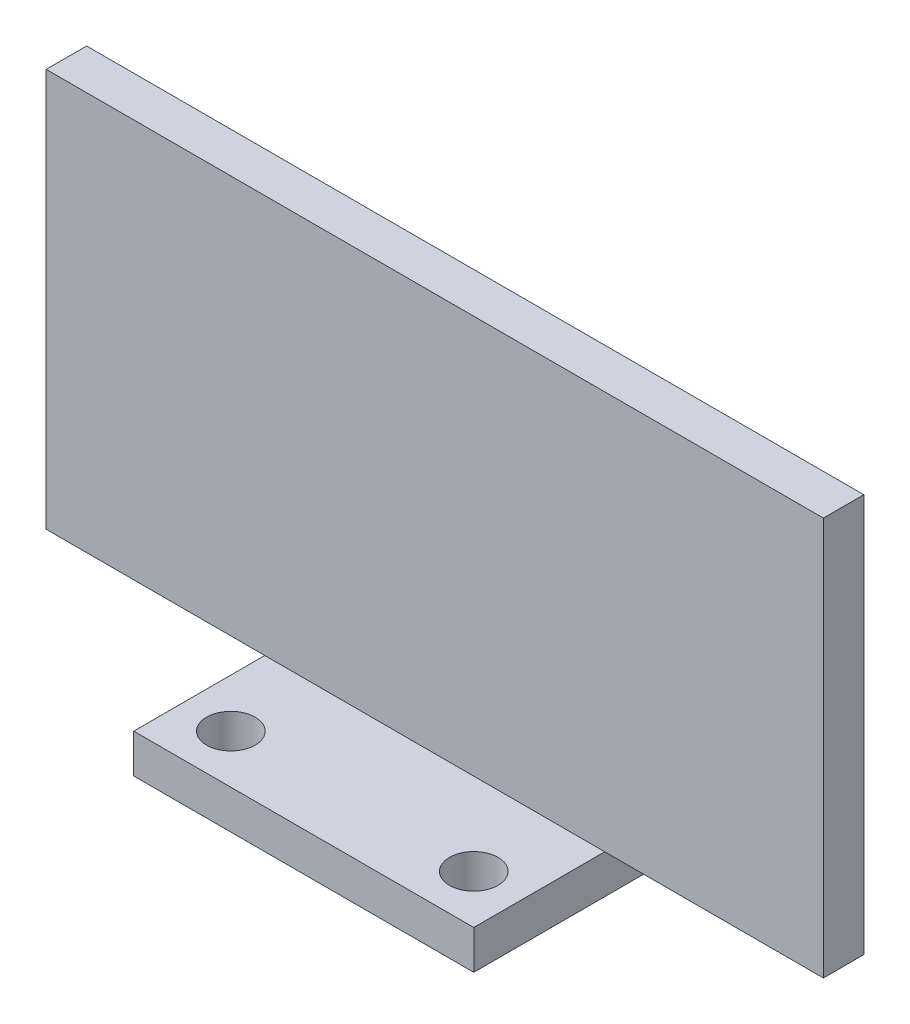
ISO-10303-21;
HEADER;
FILE_DESCRIPTION(('STEP AP214'),'2;1');
FILE_NAME('part.step','',(''),(''),'','','');
FILE_SCHEMA(('AUTOMOTIVE_DESIGN { 1 0 10303 214 1 1 1 1 }'));
ENDSEC;
DATA;
#1=APPLICATION_CONTEXT('core data for automotive mechanical design processes');
#2=APPLICATION_PROTOCOL_DEFINITION('international standard','automotive_design',2000,#1);
#3=PRODUCT_CONTEXT('',#1,'mechanical');
#4=PRODUCT('Part','Part','',(#3));
#5=PRODUCT_RELATED_PRODUCT_CATEGORY('part','',(#4));
#6=PRODUCT_DEFINITION_FORMATION('','',#4);
#7=PRODUCT_DEFINITION_CONTEXT('part definition',#1,'design');
#8=PRODUCT_DEFINITION('design','',#6,#7);
#9=PRODUCT_DEFINITION_SHAPE('','',#8);
#10=(LENGTH_UNIT() NAMED_UNIT(*) SI_UNIT(.MILLI.,.METRE.));
#11=(NAMED_UNIT(*) PLANE_ANGLE_UNIT() SI_UNIT($,.RADIAN.));
#12=(NAMED_UNIT(*) SI_UNIT($,.STERADIAN.) SOLID_ANGLE_UNIT());
#13=UNCERTAINTY_MEASURE_WITH_UNIT(LENGTH_MEASURE(1.E-05),#10,'distance_accuracy_value','');
#14=(GEOMETRIC_REPRESENTATION_CONTEXT(3) GLOBAL_UNCERTAINTY_ASSIGNED_CONTEXT((#13)) GLOBAL_UNIT_ASSIGNED_CONTEXT((#10,
#11,#12)) REPRESENTATION_CONTEXT('',''));
#15=CARTESIAN_POINT('',(0.,0.,0.));
#16=DIRECTION('',(0.,0.,1.));
#17=DIRECTION('',(1.,0.,0.));
#18=AXIS2_PLACEMENT_3D('',#15,#16,#17);
#19=CARTESIAN_POINT('',(0.,4.,0.));
#20=DIRECTION('',(0.,-1.,0.));
#21=DIRECTION('',(0.,0.,-1.));
#22=AXIS2_PLACEMENT_3D('',#19,#20,#21);
#23=PLANE('',#22);
#24=CARTESIAN_POINT('',(30.,4.,-25.));
#25=DIRECTION('',(0.,1.,0.));
#26=DIRECTION('',(0.,0.,1.));
#27=AXIS2_PLACEMENT_3D('',#24,#25,#26);
#28=CIRCLE('',#27,2.5);
#29=CARTESIAN_POINT('',(30.,4.,-22.5));
#30=VERTEX_POINT('',#29);
#31=EDGE_CURVE('E160',#30,#30,#28,.T.);
#32=ORIENTED_EDGE('',*,*,#31,.F.);
#33=EDGE_LOOP('',(#32));
#34=FACE_BOUND('',#33,.T.);
#35=CARTESIAN_POINT('',(5.,4.,-25.));
#36=DIRECTION('',(0.,1.,0.));
#37=DIRECTION('',(0.,0.,1.));
#38=AXIS2_PLACEMENT_3D('',#35,#36,#37);
#39=CIRCLE('',#38,2.5);
#40=CARTESIAN_POINT('',(5.,4.,-22.5));
#41=VERTEX_POINT('',#40);
#42=EDGE_CURVE('E166',#41,#41,#39,.T.);
#43=ORIENTED_EDGE('',*,*,#42,.F.);
#44=EDGE_LOOP('',(#43));
#45=FACE_BOUND('',#44,.T.);
#46=DIRECTION('',(-1.,0.,0.));
#47=VECTOR('',#46,1.);
#48=CARTESIAN_POINT('',(-22.5,4.,-17.6513564609073));
#49=LINE('',#48,#47);
#50=CARTESIAN_POINT('',(35.,4.,-17.6513564609073));
#51=VERTEX_POINT('',#50);
#52=CARTESIAN_POINT('',(0.,4.,-17.6513564609073));
#53=VERTEX_POINT('',#52);
#54=EDGE_CURVE('E11',#51,#53,#49,.T.);
#55=ORIENTED_EDGE('',*,*,#54,.F.);
#56=DIRECTION('',(0.,0.,-1.));
#57=VECTOR('',#56,1.);
#58=CARTESIAN_POINT('',(35.,4.,0.));
#59=LINE('',#58,#57);
#60=CARTESIAN_POINT('',(35.,4.,-30.));
#61=VERTEX_POINT('',#60);
#62=EDGE_CURVE('E178',#51,#61,#59,.T.);
#63=ORIENTED_EDGE('',*,*,#62,.T.);
#64=DIRECTION('',(-1.,0.,0.));
#65=VECTOR('',#64,1.);
#66=CARTESIAN_POINT('',(0.,4.,-30.));
#67=LINE('',#66,#65);
#68=CARTESIAN_POINT('',(0.,4.,-30.));
#69=VERTEX_POINT('',#68);
#70=EDGE_CURVE('E181',#61,#69,#67,.T.);
#71=ORIENTED_EDGE('',*,*,#70,.T.);
#72=DIRECTION('',(0.,0.,1.));
#73=VECTOR('',#72,1.);
#74=CARTESIAN_POINT('',(0.,4.,0.));
#75=LINE('',#74,#73);
#76=EDGE_CURVE('E172',#69,#53,#75,.T.);
#77=ORIENTED_EDGE('',*,*,#76,.T.);
#78=EDGE_LOOP('',(#55,#63,#71,#77));
#79=FACE_BOUND('',#78,.T.);
#80=ADVANCED_FACE('F38',(#34,#45,#79),#23,.F.);
#81=CARTESIAN_POINT('',(30.,4.,-5.));
#82=DIRECTION('',(0.,1.,0.));
#83=DIRECTION('',(0.,0.,1.));
#84=AXIS2_PLACEMENT_3D('',#81,#82,#83);
#85=CIRCLE('',#84,2.50000000000001);
#86=CARTESIAN_POINT('',(30.,4.,-2.49999999999999));
#87=VERTEX_POINT('',#86);
#88=EDGE_CURVE('E145',#87,#87,#85,.T.);
#89=ORIENTED_EDGE('',*,*,#88,.F.);
#90=EDGE_LOOP('',(#89));
#91=FACE_BOUND('',#90,.T.);
#92=CARTESIAN_POINT('',(5.,4.,-5.));
#93=DIRECTION('',(0.,1.,0.));
#94=DIRECTION('',(0.,0.,1.));
#95=AXIS2_PLACEMENT_3D('',#92,#93,#94);
#96=CIRCLE('',#95,2.5);
#97=CARTESIAN_POINT('',(5.,4.,-2.5));
#98=VERTEX_POINT('',#97);
#99=EDGE_CURVE('E154',#98,#98,#96,.T.);
#100=ORIENTED_EDGE('',*,*,#99,.F.);
#101=EDGE_LOOP('',(#100));
#102=FACE_BOUND('',#101,.T.);
#103=DIRECTION('',(1.,0.,0.));
#104=VECTOR('',#103,1.);
#105=CARTESIAN_POINT('',(-22.5,4.,-13.4880694561769));
#106=LINE('',#105,#104);
#107=CARTESIAN_POINT('',(0.,4.,-13.4880694561769));
#108=VERTEX_POINT('',#107);
#109=CARTESIAN_POINT('',(35.,4.,-13.4880694561769));
#110=VERTEX_POINT('',#109);
#111=EDGE_CURVE('E47',#108,#110,#106,.T.);
#112=ORIENTED_EDGE('',*,*,#111,.F.);
#113=CARTESIAN_POINT('',(0.,4.,0.));
#114=VERTEX_POINT('',#113);
#115=EDGE_CURVE('E176',#108,#114,#75,.T.);
#116=ORIENTED_EDGE('',*,*,#115,.T.);
#117=DIRECTION('',(1.,0.,0.));
#118=VECTOR('',#117,1.);
#119=CARTESIAN_POINT('',(0.,4.,0.));
#120=LINE('',#119,#118);
#121=CARTESIAN_POINT('',(35.,4.,0.));
#122=VERTEX_POINT('',#121);
#123=EDGE_CURVE('E174',#114,#122,#120,.T.);
#124=ORIENTED_EDGE('',*,*,#123,.T.);
#125=EDGE_CURVE('E179',#122,#110,#59,.T.);
#126=ORIENTED_EDGE('',*,*,#125,.T.);
#127=EDGE_LOOP('',(#112,#116,#124,#126));
#128=FACE_BOUND('',#127,.T.);
#129=ADVANCED_FACE('F245',(#91,#102,#128),#23,.F.);
#130=CARTESIAN_POINT('',(0.,0.,0.));
#131=DIRECTION('',(0.,-1.,0.));
#132=DIRECTION('',(0.,0.,-1.));
#133=AXIS2_PLACEMENT_3D('',#130,#131,#132);
#134=PLANE('',#133);
#135=CARTESIAN_POINT('',(5.,0.,-5.));
#136=DIRECTION('',(0.,1.,0.));
#137=DIRECTION('',(0.,0.,1.));
#138=AXIS2_PLACEMENT_3D('',#135,#136,#137);
#139=CIRCLE('',#138,2.5);
#140=CARTESIAN_POINT('',(5.,0.,-2.5));
#141=VERTEX_POINT('',#140);
#142=EDGE_CURVE('E152',#141,#141,#139,.T.);
#143=ORIENTED_EDGE('',*,*,#142,.T.);
#144=EDGE_LOOP('',(#143));
#145=FACE_BOUND('',#144,.T.);
#146=CARTESIAN_POINT('',(5.,0.,-25.));
#147=DIRECTION('',(0.,1.,0.));
#148=DIRECTION('',(0.,0.,1.));
#149=AXIS2_PLACEMENT_3D('',#146,#147,#148);
#150=CIRCLE('',#149,2.5);
#151=CARTESIAN_POINT('',(5.,0.,-22.5));
#152=VERTEX_POINT('',#151);
#153=EDGE_CURVE('E163',#152,#152,#150,.T.);
#154=ORIENTED_EDGE('',*,*,#153,.T.);
#155=EDGE_LOOP('',(#154));
#156=FACE_BOUND('',#155,.T.);
#157=DIRECTION('',(0.,0.,1.));
#158=VECTOR('',#157,1.);
#159=CARTESIAN_POINT('',(0.,0.,0.));
#160=LINE('',#159,#158);
#161=CARTESIAN_POINT('',(0.,0.,-30.));
#162=VERTEX_POINT('',#161);
#163=CARTESIAN_POINT('',(0.,0.,0.));
#164=VERTEX_POINT('',#163);
#165=EDGE_CURVE('E169',#162,#164,#160,.T.);
#166=ORIENTED_EDGE('',*,*,#165,.F.);
#167=DIRECTION('',(-1.,0.,0.));
#168=VECTOR('',#167,1.);
#169=CARTESIAN_POINT('',(0.,0.,-30.));
#170=LINE('',#169,#168);
#171=CARTESIAN_POINT('',(35.,0.,-30.));
#172=VERTEX_POINT('',#171);
#173=EDGE_CURVE('E191',#172,#162,#170,.T.);
#174=ORIENTED_EDGE('',*,*,#173,.F.);
#175=DIRECTION('',(0.,0.,-1.));
#176=VECTOR('',#175,1.);
#177=CARTESIAN_POINT('',(35.,0.,0.));
#178=LINE('',#177,#176);
#179=CARTESIAN_POINT('',(35.,0.,0.));
#180=VERTEX_POINT('',#179);
#181=EDGE_CURVE('E189',#180,#172,#178,.T.);
#182=ORIENTED_EDGE('',*,*,#181,.F.);
#183=DIRECTION('',(1.,0.,0.));
#184=VECTOR('',#183,1.);
#185=CARTESIAN_POINT('',(0.,0.,0.));
#186=LINE('',#185,#184);
#187=EDGE_CURVE('E187',#164,#180,#186,.T.);
#188=ORIENTED_EDGE('',*,*,#187,.F.);
#189=EDGE_LOOP('',(#166,#174,#182,#188));
#190=FACE_BOUND('',#189,.T.);
#191=CARTESIAN_POINT('',(30.,0.,-25.));
#192=DIRECTION('',(0.,1.,0.));
#193=DIRECTION('',(0.,0.,1.));
#194=AXIS2_PLACEMENT_3D('',#191,#192,#193);
#195=CIRCLE('',#194,2.5);
#196=CARTESIAN_POINT('',(30.,0.,-22.5));
#197=VERTEX_POINT('',#196);
#198=EDGE_CURVE('E157',#197,#197,#195,.T.);
#199=ORIENTED_EDGE('',*,*,#198,.T.);
#200=EDGE_LOOP('',(#199));
#201=FACE_BOUND('',#200,.T.);
#202=CARTESIAN_POINT('',(30.,0.,-5.));
#203=DIRECTION('',(0.,1.,0.));
#204=DIRECTION('',(0.,0.,1.));
#205=AXIS2_PLACEMENT_3D('',#202,#203,#204);
#206=CIRCLE('',#205,2.50000000000001);
#207=CARTESIAN_POINT('',(30.,0.,-2.49999999999999));
#208=VERTEX_POINT('',#207);
#209=EDGE_CURVE('E142',#208,#208,#206,.T.);
#210=ORIENTED_EDGE('',*,*,#209,.T.);
#211=EDGE_LOOP('',(#210));
#212=FACE_BOUND('',#211,.T.);
#213=ADVANCED_FACE('F248',(#145,#156,#190,#201,#212),#134,.T.);
#214=CARTESIAN_POINT('',(0.,4.,0.));
#215=DIRECTION('',(1.,0.,0.));
#216=DIRECTION('',(0.,0.,-1.));
#217=AXIS2_PLACEMENT_3D('',#214,#215,#216);
#218=PLANE('',#217);
#219=ORIENTED_EDGE('',*,*,#165,.T.);
#220=DIRECTION('',(0.,-1.,0.));
#221=VECTOR('',#220,1.);
#222=CARTESIAN_POINT('',(0.,4.,0.));
#223=LINE('',#222,#221);
#224=EDGE_CURVE('E42',#114,#164,#223,.T.);
#225=ORIENTED_EDGE('',*,*,#224,.F.);
#226=ORIENTED_EDGE('',*,*,#115,.F.);
#227=EDGE_CURVE('E175',#53,#108,#75,.T.);
#228=ORIENTED_EDGE('',*,*,#227,.F.);
#229=ORIENTED_EDGE('',*,*,#76,.F.);
#230=DIRECTION('',(0.,-1.,0.));
#231=VECTOR('',#230,1.);
#232=CARTESIAN_POINT('',(0.,4.,-30.));
#233=LINE('',#232,#231);
#234=EDGE_CURVE('E184',#69,#162,#233,.T.);
#235=ORIENTED_EDGE('',*,*,#234,.T.);
#236=EDGE_LOOP('',(#219,#225,#226,#228,#229,#235));
#237=FACE_BOUND('',#236,.T.);
#238=ADVANCED_FACE('F40',(#237),#218,.F.);
#239=CARTESIAN_POINT('',(0.,4.,0.));
#240=DIRECTION('',(0.,0.,-1.));
#241=DIRECTION('',(-1.,0.,0.));
#242=AXIS2_PLACEMENT_3D('',#239,#240,#241);
#243=PLANE('',#242);
#244=ORIENTED_EDGE('',*,*,#187,.T.);
#245=DIRECTION('',(0.,-1.,0.));
#246=VECTOR('',#245,1.);
#247=CARTESIAN_POINT('',(35.,4.,0.));
#248=LINE('',#247,#246);
#249=EDGE_CURVE('E197',#122,#180,#248,.T.);
#250=ORIENTED_EDGE('',*,*,#249,.F.);
#251=ORIENTED_EDGE('',*,*,#123,.F.);
#252=ORIENTED_EDGE('',*,*,#224,.T.);
#253=EDGE_LOOP('',(#244,#250,#251,#252));
#254=FACE_BOUND('',#253,.T.);
#255=ADVANCED_FACE('F246',(#254),#243,.F.);
#256=CARTESIAN_POINT('',(35.,4.,0.));
#257=DIRECTION('',(-1.,0.,0.));
#258=DIRECTION('',(0.,0.,1.));
#259=AXIS2_PLACEMENT_3D('',#256,#257,#258);
#260=PLANE('',#259);
#261=ORIENTED_EDGE('',*,*,#181,.T.);
#262=DIRECTION('',(0.,-1.,0.));
#263=VECTOR('',#262,1.);
#264=CARTESIAN_POINT('',(35.,4.,-30.));
#265=LINE('',#264,#263);
#266=EDGE_CURVE('E195',#61,#172,#265,.T.);
#267=ORIENTED_EDGE('',*,*,#266,.F.);
#268=ORIENTED_EDGE('',*,*,#62,.F.);
#269=EDGE_CURVE('E182',#110,#51,#59,.T.);
#270=ORIENTED_EDGE('',*,*,#269,.F.);
#271=ORIENTED_EDGE('',*,*,#125,.F.);
#272=ORIENTED_EDGE('',*,*,#249,.T.);
#273=EDGE_LOOP('',(#261,#267,#268,#270,#271,#272));
#274=FACE_BOUND('',#273,.T.);
#275=ADVANCED_FACE('F235',(#274),#260,.F.);
#276=CARTESIAN_POINT('',(0.,4.,-30.));
#277=DIRECTION('',(0.,0.,1.));
#278=DIRECTION('',(1.,0.,0.));
#279=AXIS2_PLACEMENT_3D('',#276,#277,#278);
#280=PLANE('',#279);
#281=ORIENTED_EDGE('',*,*,#173,.T.);
#282=ORIENTED_EDGE('',*,*,#234,.F.);
#283=ORIENTED_EDGE('',*,*,#70,.F.);
#284=ORIENTED_EDGE('',*,*,#266,.T.);
#285=EDGE_LOOP('',(#281,#282,#283,#284));
#286=FACE_BOUND('',#285,.T.);
#287=ADVANCED_FACE('F238',(#286),#280,.F.);
#288=CARTESIAN_POINT('',(5.,4.,-25.));
#289=DIRECTION('',(0.,-1.,0.));
#290=DIRECTION('',(0.,0.,-1.));
#291=AXIS2_PLACEMENT_3D('',#288,#289,#290);
#292=CYLINDRICAL_SURFACE('',#291,2.5);
#293=ORIENTED_EDGE('',*,*,#42,.T.);
#294=EDGE_LOOP('',(#293));
#295=FACE_BOUND('',#294,.T.);
#296=ORIENTED_EDGE('',*,*,#153,.F.);
#297=EDGE_LOOP('',(#296));
#298=FACE_BOUND('',#297,.T.);
#299=ADVANCED_FACE('F281',(#295,#298),#292,.F.);
#300=CARTESIAN_POINT('',(30.,4.,-25.));
#301=DIRECTION('',(0.,-1.,0.));
#302=DIRECTION('',(0.,0.,-1.));
#303=AXIS2_PLACEMENT_3D('',#300,#301,#302);
#304=CYLINDRICAL_SURFACE('',#303,2.5);
#305=ORIENTED_EDGE('',*,*,#31,.T.);
#306=EDGE_LOOP('',(#305));
#307=FACE_BOUND('',#306,.T.);
#308=ORIENTED_EDGE('',*,*,#198,.F.);
#309=EDGE_LOOP('',(#308));
#310=FACE_BOUND('',#309,.T.);
#311=ADVANCED_FACE('F267',(#307,#310),#304,.F.);
#312=CARTESIAN_POINT('',(5.,4.,-5.));
#313=DIRECTION('',(0.,-1.,0.));
#314=DIRECTION('',(0.,0.,-1.));
#315=AXIS2_PLACEMENT_3D('',#312,#313,#314);
#316=CYLINDRICAL_SURFACE('',#315,2.5);
#317=ORIENTED_EDGE('',*,*,#99,.T.);
#318=EDGE_LOOP('',(#317));
#319=FACE_BOUND('',#318,.T.);
#320=ORIENTED_EDGE('',*,*,#142,.F.);
#321=EDGE_LOOP('',(#320));
#322=FACE_BOUND('',#321,.T.);
#323=ADVANCED_FACE('F259',(#319,#322),#316,.F.);
#324=CARTESIAN_POINT('',(30.,4.,-5.));
#325=DIRECTION('',(0.,-1.,0.));
#326=DIRECTION('',(0.,0.,-1.));
#327=AXIS2_PLACEMENT_3D('',#324,#325,#326);
#328=CYLINDRICAL_SURFACE('',#327,2.50000000000001);
#329=ORIENTED_EDGE('',*,*,#88,.T.);
#330=EDGE_LOOP('',(#329));
#331=FACE_BOUND('',#330,.T.);
#332=ORIENTED_EDGE('',*,*,#209,.F.);
#333=EDGE_LOOP('',(#332));
#334=FACE_BOUND('',#333,.T.);
#335=ADVANCED_FACE('F257',(#331,#334),#328,.F.);
#336=CARTESIAN_POINT('',(0.,4.,0.));
#337=DIRECTION('',(0.,1.,0.));
#338=DIRECTION('',(0.,0.,1.));
#339=AXIS2_PLACEMENT_3D('',#336,#337,#338);
#340=PLANE('',#339);
#341=CARTESIAN_POINT('',(-22.5,4.,-17.6513564609073));
#342=VERTEX_POINT('',#341);
#343=EDGE_CURVE('E50',#53,#342,#49,.T.);
#344=ORIENTED_EDGE('',*,*,#343,.F.);
#345=ORIENTED_EDGE('',*,*,#227,.T.);
#346=CARTESIAN_POINT('',(-22.5,4.,-13.4880694561769));
#347=VERTEX_POINT('',#346);
#348=EDGE_CURVE('E208',#347,#108,#106,.T.);
#349=ORIENTED_EDGE('',*,*,#348,.F.);
#350=DIRECTION('',(0.,0.,1.));
#351=VECTOR('',#350,1.);
#352=CARTESIAN_POINT('',(-22.5,4.,-17.6513564609073));
#353=LINE('',#352,#351);
#354=EDGE_CURVE('E141',#342,#347,#353,.T.);
#355=ORIENTED_EDGE('',*,*,#354,.F.);
#356=EDGE_LOOP('',(#344,#345,#349,#355));
#357=FACE_BOUND('',#356,.T.);
#358=ADVANCED_FACE('F244',(#357),#340,.F.);
#359=CARTESIAN_POINT('',(57.5,4.,-13.4880694561769));
#360=VERTEX_POINT('',#359);
#361=EDGE_CURVE('E209',#110,#360,#106,.T.);
#362=ORIENTED_EDGE('',*,*,#361,.F.);
#363=ORIENTED_EDGE('',*,*,#269,.T.);
#364=CARTESIAN_POINT('',(57.5,4.,-17.6513564609073));
#365=VERTEX_POINT('',#364);
#366=EDGE_CURVE('E49',#365,#51,#49,.T.);
#367=ORIENTED_EDGE('',*,*,#366,.F.);
#368=DIRECTION('',(0.,0.,-1.));
#369=VECTOR('',#368,1.);
#370=CARTESIAN_POINT('',(57.5,4.,-17.6513564609073));
#371=LINE('',#370,#369);
#372=EDGE_CURVE('E212',#360,#365,#371,.T.);
#373=ORIENTED_EDGE('',*,*,#372,.F.);
#374=EDGE_LOOP('',(#362,#363,#367,#373));
#375=FACE_BOUND('',#374,.T.);
#376=ADVANCED_FACE('F230',(#375),#340,.F.);
#377=CARTESIAN_POINT('',(-22.5,45.,-17.6513564609073));
#378=DIRECTION('',(1.,0.,0.));
#379=DIRECTION('',(0.,0.,-1.));
#380=AXIS2_PLACEMENT_3D('',#377,#378,#379);
#381=PLANE('',#380);
#382=ORIENTED_EDGE('',*,*,#354,.T.);
#383=DIRECTION('',(0.,-1.,0.));
#384=VECTOR('',#383,1.);
#385=CARTESIAN_POINT('',(-22.5,45.,-13.4880694561769));
#386=LINE('',#385,#384);
#387=CARTESIAN_POINT('',(-22.5,45.,-13.4880694561769));
#388=VERTEX_POINT('',#387);
#389=EDGE_CURVE('E122',#388,#347,#386,.T.);
#390=ORIENTED_EDGE('',*,*,#389,.F.);
#391=DIRECTION('',(0.,0.,1.));
#392=VECTOR('',#391,1.);
#393=CARTESIAN_POINT('',(-22.5,45.,-17.6513564609073));
#394=LINE('',#393,#392);
#395=CARTESIAN_POINT('',(-22.5,45.,-17.6513564609073));
#396=VERTEX_POINT('',#395);
#397=EDGE_CURVE('E129',#396,#388,#394,.T.);
#398=ORIENTED_EDGE('',*,*,#397,.F.);
#399=DIRECTION('',(0.,-1.,0.));
#400=VECTOR('',#399,1.);
#401=CARTESIAN_POINT('',(-22.5,45.,-17.6513564609073));
#402=LINE('',#401,#400);
#403=EDGE_CURVE('E216',#396,#342,#402,.T.);
#404=ORIENTED_EDGE('',*,*,#403,.T.);
#405=EDGE_LOOP('',(#382,#390,#398,#404));
#406=FACE_BOUND('',#405,.T.);
#407=ADVANCED_FACE('F139',(#406),#381,.F.);
#408=CARTESIAN_POINT('',(-22.5,45.,-13.4880694561769));
#409=DIRECTION('',(0.,0.,-1.));
#410=DIRECTION('',(-1.,0.,0.));
#411=AXIS2_PLACEMENT_3D('',#408,#409,#410);
#412=PLANE('',#411);
#413=ORIENTED_EDGE('',*,*,#348,.T.);
#414=ORIENTED_EDGE('',*,*,#111,.T.);
#415=ORIENTED_EDGE('',*,*,#361,.T.);
#416=DIRECTION('',(0.,-1.,0.));
#417=VECTOR('',#416,1.);
#418=CARTESIAN_POINT('',(57.5,45.,-13.4880694561769));
#419=LINE('',#418,#417);
#420=CARTESIAN_POINT('',(57.5,45.,-13.4880694561769));
#421=VERTEX_POINT('',#420);
#422=EDGE_CURVE('E125',#421,#360,#419,.T.);
#423=ORIENTED_EDGE('',*,*,#422,.F.);
#424=DIRECTION('',(1.,0.,0.));
#425=VECTOR('',#424,1.);
#426=CARTESIAN_POINT('',(-22.5,45.,-13.4880694561769));
#427=LINE('',#426,#425);
#428=EDGE_CURVE('E117',#388,#421,#427,.T.);
#429=ORIENTED_EDGE('',*,*,#428,.F.);
#430=ORIENTED_EDGE('',*,*,#389,.T.);
#431=EDGE_LOOP('',(#413,#414,#415,#423,#429,#430));
#432=FACE_BOUND('',#431,.T.);
#433=ADVANCED_FACE('F120',(#432),#412,.F.);
#434=CARTESIAN_POINT('',(57.5,45.,-17.6513564609073));
#435=DIRECTION('',(-1.,0.,0.));
#436=DIRECTION('',(0.,0.,1.));
#437=AXIS2_PLACEMENT_3D('',#434,#435,#436);
#438=PLANE('',#437);
#439=ORIENTED_EDGE('',*,*,#372,.T.);
#440=DIRECTION('',(0.,-1.,0.));
#441=VECTOR('',#440,1.);
#442=CARTESIAN_POINT('',(57.5,45.,-17.6513564609073));
#443=LINE('',#442,#441);
#444=CARTESIAN_POINT('',(57.5,45.,-17.6513564609073));
#445=VERTEX_POINT('',#444);
#446=EDGE_CURVE('E147',#445,#365,#443,.T.);
#447=ORIENTED_EDGE('',*,*,#446,.F.);
#448=DIRECTION('',(0.,0.,-1.));
#449=VECTOR('',#448,1.);
#450=CARTESIAN_POINT('',(57.5,45.,-17.6513564609073));
#451=LINE('',#450,#449);
#452=EDGE_CURVE('E128',#421,#445,#451,.T.);
#453=ORIENTED_EDGE('',*,*,#452,.F.);
#454=ORIENTED_EDGE('',*,*,#422,.T.);
#455=EDGE_LOOP('',(#439,#447,#453,#454));
#456=FACE_BOUND('',#455,.T.);
#457=ADVANCED_FACE('F220',(#456),#438,.F.);
#458=CARTESIAN_POINT('',(-22.5,45.,-17.6513564609073));
#459=DIRECTION('',(0.,0.,1.));
#460=DIRECTION('',(1.,0.,0.));
#461=AXIS2_PLACEMENT_3D('',#458,#459,#460);
#462=PLANE('',#461);
#463=ORIENTED_EDGE('',*,*,#366,.T.);
#464=ORIENTED_EDGE('',*,*,#54,.T.);
#465=ORIENTED_EDGE('',*,*,#343,.T.);
#466=ORIENTED_EDGE('',*,*,#403,.F.);
#467=DIRECTION('',(-1.,0.,0.));
#468=VECTOR('',#467,1.);
#469=CARTESIAN_POINT('',(-22.5,45.,-17.6513564609073));
#470=LINE('',#469,#468);
#471=EDGE_CURVE('E134',#445,#396,#470,.T.);
#472=ORIENTED_EDGE('',*,*,#471,.F.);
#473=ORIENTED_EDGE('',*,*,#446,.T.);
#474=EDGE_LOOP('',(#463,#464,#465,#466,#472,#473));
#475=FACE_BOUND('',#474,.T.);
#476=ADVANCED_FACE('F225',(#475),#462,.F.);
#477=CARTESIAN_POINT('',(0.,45.,0.));
#478=DIRECTION('',(0.,1.,0.));
#479=DIRECTION('',(0.,0.,1.));
#480=AXIS2_PLACEMENT_3D('',#477,#478,#479);
#481=PLANE('',#480);
#482=ORIENTED_EDGE('',*,*,#397,.T.);
#483=ORIENTED_EDGE('',*,*,#428,.T.);
#484=ORIENTED_EDGE('',*,*,#452,.T.);
#485=ORIENTED_EDGE('',*,*,#471,.T.);
#486=EDGE_LOOP('',(#482,#483,#484,#485));
#487=FACE_BOUND('',#486,.T.);
#488=ADVANCED_FACE('F132',(#487),#481,.T.);
#489=CLOSED_SHELL('',(#80,#129,#213,#238,#255,#275,#287,#299,#311,#323,#335,#358,#376,#407,#433,
#457,#476,#488));
#490=MANIFOLD_SOLID_BREP('B2',#489);
#491=ADVANCED_BREP_SHAPE_REPRESENTATION('',(#18,#490),#14);
#492=SHAPE_DEFINITION_REPRESENTATION(#9,#491);
ENDSEC;
END-ISO-10303-21;
